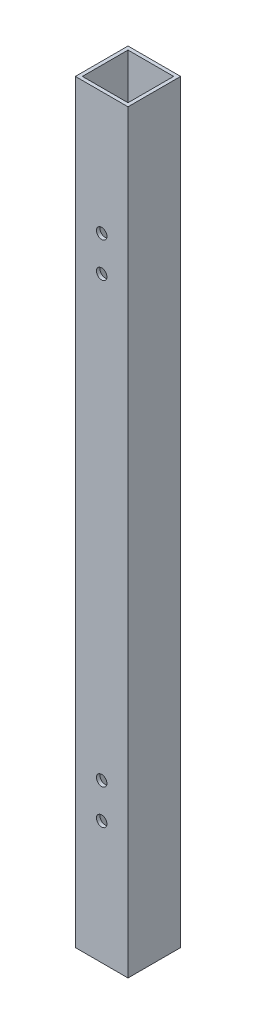
ISO-10303-21;
HEADER;
FILE_DESCRIPTION(('STEP AP214'),'2;1');
FILE_NAME('part.step','',(''),(''),'','','');
FILE_SCHEMA(('AUTOMOTIVE_DESIGN { 1 0 10303 214 1 1 1 1 }'));
ENDSEC;
DATA;
#1=APPLICATION_CONTEXT('core data for automotive mechanical design processes');
#2=APPLICATION_PROTOCOL_DEFINITION('international standard','automotive_design',2000,#1);
#3=PRODUCT_CONTEXT('',#1,'mechanical');
#4=PRODUCT('Part','Part','',(#3));
#5=PRODUCT_RELATED_PRODUCT_CATEGORY('part','',(#4));
#6=PRODUCT_DEFINITION_FORMATION('','',#4);
#7=PRODUCT_DEFINITION_CONTEXT('part definition',#1,'design');
#8=PRODUCT_DEFINITION('design','',#6,#7);
#9=PRODUCT_DEFINITION_SHAPE('','',#8);
#10=(LENGTH_UNIT() NAMED_UNIT(*) SI_UNIT(.MILLI.,.METRE.));
#11=(NAMED_UNIT(*) PLANE_ANGLE_UNIT() SI_UNIT($,.RADIAN.));
#12=(NAMED_UNIT(*) SI_UNIT($,.STERADIAN.) SOLID_ANGLE_UNIT());
#13=UNCERTAINTY_MEASURE_WITH_UNIT(LENGTH_MEASURE(1.E-05),#10,'distance_accuracy_value','');
#14=(GEOMETRIC_REPRESENTATION_CONTEXT(3) GLOBAL_UNCERTAINTY_ASSIGNED_CONTEXT((#13)) GLOBAL_UNIT_ASSIGNED_CONTEXT((#10,
#11,#12)) REPRESENTATION_CONTEXT('',''));
#15=CARTESIAN_POINT('',(0.,0.,0.));
#16=DIRECTION('',(0.,0.,1.));
#17=DIRECTION('',(1.,0.,0.));
#18=AXIS2_PLACEMENT_3D('',#15,#16,#17);
#19=CARTESIAN_POINT('',(15.,430.,15.));
#20=DIRECTION('',(0.,0.,-1.));
#21=DIRECTION('',(-1.,0.,0.));
#22=AXIS2_PLACEMENT_3D('',#19,#20,#21);
#23=PLANE('',#22);
#24=CARTESIAN_POINT('',(0.,70.,15.));
#25=DIRECTION('',(0.,0.,1.));
#26=DIRECTION('',(1.,0.,0.));
#27=AXIS2_PLACEMENT_3D('',#24,#25,#26);
#28=CIRCLE('',#27,3.);
#29=CARTESIAN_POINT('',(3.,70.,15.));
#30=VERTEX_POINT('',#29);
#31=EDGE_CURVE('E395',#30,#30,#28,.T.);
#32=ORIENTED_EDGE('',*,*,#31,.F.);
#33=EDGE_LOOP('',(#32));
#34=FACE_BOUND('',#33,.T.);
#35=CARTESIAN_POINT('',(0.,90.,15.));
#36=DIRECTION('',(0.,0.,1.));
#37=DIRECTION('',(1.,0.,0.));
#38=AXIS2_PLACEMENT_3D('',#35,#36,#37);
#39=CIRCLE('',#38,3.);
#40=CARTESIAN_POINT('',(3.,90.,15.));
#41=VERTEX_POINT('',#40);
#42=EDGE_CURVE('E181',#41,#41,#39,.T.);
#43=ORIENTED_EDGE('',*,*,#42,.F.);
#44=EDGE_LOOP('',(#43));
#45=FACE_BOUND('',#44,.T.);
#46=CARTESIAN_POINT('',(0.,340.,15.));
#47=DIRECTION('',(0.,0.,1.));
#48=DIRECTION('',(1.,0.,0.));
#49=AXIS2_PLACEMENT_3D('',#46,#47,#48);
#50=CIRCLE('',#49,3.);
#51=CARTESIAN_POINT('',(3.,340.,15.));
#52=VERTEX_POINT('',#51);
#53=EDGE_CURVE('E178',#52,#52,#50,.T.);
#54=ORIENTED_EDGE('',*,*,#53,.F.);
#55=EDGE_LOOP('',(#54));
#56=FACE_BOUND('',#55,.T.);
#57=CARTESIAN_POINT('',(0.,360.,15.));
#58=DIRECTION('',(0.,0.,1.));
#59=DIRECTION('',(1.,0.,0.));
#60=AXIS2_PLACEMENT_3D('',#57,#58,#59);
#61=CIRCLE('',#60,3.);
#62=CARTESIAN_POINT('',(3.,360.,15.));
#63=VERTEX_POINT('',#62);
#64=EDGE_CURVE('E197',#63,#63,#61,.T.);
#65=ORIENTED_EDGE('',*,*,#64,.F.);
#66=EDGE_LOOP('',(#65));
#67=FACE_BOUND('',#66,.T.);
#68=DIRECTION('',(1.,0.,0.));
#69=VECTOR('',#68,1.);
#70=CARTESIAN_POINT('',(15.,0.,15.));
#71=LINE('',#70,#69);
#72=CARTESIAN_POINT('',(-15.,0.,15.));
#73=VERTEX_POINT('',#72);
#74=CARTESIAN_POINT('',(15.,0.,15.));
#75=VERTEX_POINT('',#74);
#76=EDGE_CURVE('E134',#73,#75,#71,.T.);
#77=ORIENTED_EDGE('',*,*,#76,.T.);
#78=DIRECTION('',(0.,-1.,0.));
#79=VECTOR('',#78,1.);
#80=CARTESIAN_POINT('',(15.,430.,15.));
#81=LINE('',#80,#79);
#82=CARTESIAN_POINT('',(15.,430.,15.));
#83=VERTEX_POINT('',#82);
#84=EDGE_CURVE('E40',#83,#75,#81,.T.);
#85=ORIENTED_EDGE('',*,*,#84,.F.);
#86=DIRECTION('',(1.,0.,0.));
#87=VECTOR('',#86,1.);
#88=CARTESIAN_POINT('',(15.,430.,15.));
#89=LINE('',#88,#87);
#90=CARTESIAN_POINT('',(-15.,430.,15.));
#91=VERTEX_POINT('',#90);
#92=EDGE_CURVE('E141',#91,#83,#89,.T.);
#93=ORIENTED_EDGE('',*,*,#92,.F.);
#94=DIRECTION('',(0.,-1.,0.));
#95=VECTOR('',#94,1.);
#96=CARTESIAN_POINT('',(-15.,430.,15.));
#97=LINE('',#96,#95);
#98=EDGE_CURVE('E11',#91,#73,#97,.T.);
#99=ORIENTED_EDGE('',*,*,#98,.T.);
#100=EDGE_LOOP('',(#77,#85,#93,#99));
#101=FACE_BOUND('',#100,.T.);
#102=ADVANCED_FACE('F32',(#34,#45,#56,#67,#101),#23,.F.);
#103=CARTESIAN_POINT('',(15.,430.,-15.));
#104=DIRECTION('',(-1.,0.,0.));
#105=DIRECTION('',(0.,0.,1.));
#106=AXIS2_PLACEMENT_3D('',#103,#104,#105);
#107=PLANE('',#106);
#108=DIRECTION('',(0.,0.,-1.));
#109=VECTOR('',#108,1.);
#110=CARTESIAN_POINT('',(15.,0.,-15.));
#111=LINE('',#110,#109);
#112=CARTESIAN_POINT('',(15.,0.,-15.));
#113=VERTEX_POINT('',#112);
#114=EDGE_CURVE('E151',#75,#113,#111,.T.);
#115=ORIENTED_EDGE('',*,*,#114,.T.);
#116=DIRECTION('',(0.,-1.,0.));
#117=VECTOR('',#116,1.);
#118=CARTESIAN_POINT('',(15.,430.,-15.));
#119=LINE('',#118,#117);
#120=CARTESIAN_POINT('',(15.,430.,-15.));
#121=VERTEX_POINT('',#120);
#122=EDGE_CURVE('E158',#121,#113,#119,.T.);
#123=ORIENTED_EDGE('',*,*,#122,.F.);
#124=DIRECTION('',(0.,0.,-1.));
#125=VECTOR('',#124,1.);
#126=CARTESIAN_POINT('',(15.,430.,-15.));
#127=LINE('',#126,#125);
#128=EDGE_CURVE('E144',#83,#121,#127,.T.);
#129=ORIENTED_EDGE('',*,*,#128,.F.);
#130=ORIENTED_EDGE('',*,*,#84,.T.);
#131=EDGE_LOOP('',(#115,#123,#129,#130));
#132=FACE_BOUND('',#131,.T.);
#133=ADVANCED_FACE('F207',(#132),#107,.F.);
#134=CARTESIAN_POINT('',(-15.,430.,-15.));
#135=DIRECTION('',(0.,0.,1.));
#136=DIRECTION('',(1.,0.,0.));
#137=AXIS2_PLACEMENT_3D('',#134,#135,#136);
#138=PLANE('',#137);
#139=CARTESIAN_POINT('',(0.,70.,-15.));
#140=DIRECTION('',(0.,0.,1.));
#141=DIRECTION('',(1.,0.,0.));
#142=AXIS2_PLACEMENT_3D('',#139,#140,#141);
#143=CIRCLE('',#142,3.);
#144=CARTESIAN_POINT('',(3.,70.,-15.));
#145=VERTEX_POINT('',#144);
#146=EDGE_CURVE('E392',#145,#145,#143,.T.);
#147=ORIENTED_EDGE('',*,*,#146,.T.);
#148=EDGE_LOOP('',(#147));
#149=FACE_BOUND('',#148,.T.);
#150=CARTESIAN_POINT('',(0.,90.,-15.));
#151=DIRECTION('',(0.,0.,1.));
#152=DIRECTION('',(1.,0.,0.));
#153=AXIS2_PLACEMENT_3D('',#150,#151,#152);
#154=CIRCLE('',#153,3.);
#155=CARTESIAN_POINT('',(3.,90.,-15.));
#156=VERTEX_POINT('',#155);
#157=EDGE_CURVE('E174',#156,#156,#154,.T.);
#158=ORIENTED_EDGE('',*,*,#157,.T.);
#159=EDGE_LOOP('',(#158));
#160=FACE_BOUND('',#159,.T.);
#161=CARTESIAN_POINT('',(0.,340.,-15.));
#162=DIRECTION('',(0.,0.,1.));
#163=DIRECTION('',(1.,0.,0.));
#164=AXIS2_PLACEMENT_3D('',#161,#162,#163);
#165=CIRCLE('',#164,3.);
#166=CARTESIAN_POINT('',(3.,340.,-15.));
#167=VERTEX_POINT('',#166);
#168=EDGE_CURVE('E170',#167,#167,#165,.T.);
#169=ORIENTED_EDGE('',*,*,#168,.T.);
#170=EDGE_LOOP('',(#169));
#171=FACE_BOUND('',#170,.T.);
#172=CARTESIAN_POINT('',(0.,360.,-15.));
#173=DIRECTION('',(0.,0.,1.));
#174=DIRECTION('',(1.,0.,0.));
#175=AXIS2_PLACEMENT_3D('',#172,#173,#174);
#176=CIRCLE('',#175,3.);
#177=CARTESIAN_POINT('',(3.,360.,-15.));
#178=VERTEX_POINT('',#177);
#179=EDGE_CURVE('E166',#178,#178,#176,.T.);
#180=ORIENTED_EDGE('',*,*,#179,.T.);
#181=EDGE_LOOP('',(#180));
#182=FACE_BOUND('',#181,.T.);
#183=DIRECTION('',(-1.,0.,0.));
#184=VECTOR('',#183,1.);
#185=CARTESIAN_POINT('',(-15.,0.,-15.));
#186=LINE('',#185,#184);
#187=CARTESIAN_POINT('',(-15.,0.,-15.));
#188=VERTEX_POINT('',#187);
#189=EDGE_CURVE('E153',#113,#188,#186,.T.);
#190=ORIENTED_EDGE('',*,*,#189,.T.);
#191=DIRECTION('',(0.,-1.,0.));
#192=VECTOR('',#191,1.);
#193=CARTESIAN_POINT('',(-15.,430.,-15.));
#194=LINE('',#193,#192);
#195=CARTESIAN_POINT('',(-15.,430.,-15.));
#196=VERTEX_POINT('',#195);
#197=EDGE_CURVE('E149',#196,#188,#194,.T.);
#198=ORIENTED_EDGE('',*,*,#197,.F.);
#199=DIRECTION('',(-1.,0.,0.));
#200=VECTOR('',#199,1.);
#201=CARTESIAN_POINT('',(-15.,430.,-15.));
#202=LINE('',#201,#200);
#203=EDGE_CURVE('E146',#121,#196,#202,.T.);
#204=ORIENTED_EDGE('',*,*,#203,.F.);
#205=ORIENTED_EDGE('',*,*,#122,.T.);
#206=EDGE_LOOP('',(#190,#198,#204,#205));
#207=FACE_BOUND('',#206,.T.);
#208=ADVANCED_FACE('F220',(#149,#160,#171,#182,#207),#138,.F.);
#209=CARTESIAN_POINT('',(-15.,430.,0.));
#210=DIRECTION('',(1.,0.,0.));
#211=DIRECTION('',(0.,0.,-1.));
#212=AXIS2_PLACEMENT_3D('',#209,#210,#211);
#213=PLANE('',#212);
#214=DIRECTION('',(0.,0.,1.));
#215=VECTOR('',#214,1.);
#216=CARTESIAN_POINT('',(-15.,0.,0.));
#217=LINE('',#216,#215);
#218=EDGE_CURVE('E142',#188,#73,#217,.T.);
#219=ORIENTED_EDGE('',*,*,#218,.T.);
#220=ORIENTED_EDGE('',*,*,#98,.F.);
#221=DIRECTION('',(0.,0.,1.));
#222=VECTOR('',#221,1.);
#223=CARTESIAN_POINT('',(-15.,430.,15.));
#224=LINE('',#223,#222);
#225=EDGE_CURVE('E138',#196,#91,#224,.T.);
#226=ORIENTED_EDGE('',*,*,#225,.F.);
#227=ORIENTED_EDGE('',*,*,#197,.T.);
#228=EDGE_LOOP('',(#219,#220,#226,#227));
#229=FACE_BOUND('',#228,.T.);
#230=ADVANCED_FACE('F223',(#229),#213,.F.);
#231=CARTESIAN_POINT('',(0.,430.,0.));
#232=DIRECTION('',(0.,-1.,0.));
#233=DIRECTION('',(0.,0.,-1.));
#234=AXIS2_PLACEMENT_3D('',#231,#232,#233);
#235=PLANE('',#234);
#236=DIRECTION('',(0.,0.,-1.));
#237=VECTOR('',#236,1.);
#238=CARTESIAN_POINT('',(13.,430.,13.));
#239=LINE('',#238,#237);
#240=CARTESIAN_POINT('',(13.,430.,13.));
#241=VERTEX_POINT('',#240);
#242=CARTESIAN_POINT('',(13.,430.,-13.));
#243=VERTEX_POINT('',#242);
#244=EDGE_CURVE('E128',#241,#243,#239,.T.);
#245=ORIENTED_EDGE('',*,*,#244,.F.);
#246=DIRECTION('',(1.,0.,0.));
#247=VECTOR('',#246,1.);
#248=CARTESIAN_POINT('',(-13.,430.,13.));
#249=LINE('',#248,#247);
#250=CARTESIAN_POINT('',(-13.,430.,13.));
#251=VERTEX_POINT('',#250);
#252=EDGE_CURVE('E48',#251,#241,#249,.T.);
#253=ORIENTED_EDGE('',*,*,#252,.F.);
#254=DIRECTION('',(0.,0.,1.));
#255=VECTOR('',#254,1.);
#256=CARTESIAN_POINT('',(-13.,430.,-13.));
#257=LINE('',#256,#255);
#258=CARTESIAN_POINT('',(-13.,430.,-13.));
#259=VERTEX_POINT('',#258);
#260=EDGE_CURVE('E116',#259,#251,#257,.T.);
#261=ORIENTED_EDGE('',*,*,#260,.F.);
#262=DIRECTION('',(-1.,0.,0.));
#263=VECTOR('',#262,1.);
#264=CARTESIAN_POINT('',(13.,430.,-13.));
#265=LINE('',#264,#263);
#266=EDGE_CURVE('E119',#243,#259,#265,.T.);
#267=ORIENTED_EDGE('',*,*,#266,.F.);
#268=EDGE_LOOP('',(#245,#253,#261,#267));
#269=FACE_BOUND('',#268,.T.);
#270=ORIENTED_EDGE('',*,*,#225,.T.);
#271=ORIENTED_EDGE('',*,*,#92,.T.);
#272=ORIENTED_EDGE('',*,*,#128,.T.);
#273=ORIENTED_EDGE('',*,*,#203,.T.);
#274=EDGE_LOOP('',(#270,#271,#272,#273));
#275=FACE_BOUND('',#274,.T.);
#276=ADVANCED_FACE('F225',(#269,#275),#235,.F.);
#277=CARTESIAN_POINT('',(0.,0.,0.));
#278=DIRECTION('',(0.,-1.,0.));
#279=DIRECTION('',(0.,0.,-1.));
#280=AXIS2_PLACEMENT_3D('',#277,#278,#279);
#281=PLANE('',#280);
#282=DIRECTION('',(1.,0.,0.));
#283=VECTOR('',#282,1.);
#284=CARTESIAN_POINT('',(-13.,0.,13.));
#285=LINE('',#284,#283);
#286=CARTESIAN_POINT('',(-13.,0.,13.));
#287=VERTEX_POINT('',#286);
#288=CARTESIAN_POINT('',(13.,0.,13.));
#289=VERTEX_POINT('',#288);
#290=EDGE_CURVE('E100',#287,#289,#285,.T.);
#291=ORIENTED_EDGE('',*,*,#290,.T.);
#292=DIRECTION('',(0.,0.,-1.));
#293=VECTOR('',#292,1.);
#294=CARTESIAN_POINT('',(13.,0.,13.));
#295=LINE('',#294,#293);
#296=CARTESIAN_POINT('',(13.,0.,-13.));
#297=VERTEX_POINT('',#296);
#298=EDGE_CURVE('E109',#289,#297,#295,.T.);
#299=ORIENTED_EDGE('',*,*,#298,.T.);
#300=DIRECTION('',(-1.,0.,0.));
#301=VECTOR('',#300,1.);
#302=CARTESIAN_POINT('',(13.,0.,-13.));
#303=LINE('',#302,#301);
#304=CARTESIAN_POINT('',(-13.,0.,-13.));
#305=VERTEX_POINT('',#304);
#306=EDGE_CURVE('E56',#297,#305,#303,.T.);
#307=ORIENTED_EDGE('',*,*,#306,.T.);
#308=DIRECTION('',(0.,0.,1.));
#309=VECTOR('',#308,1.);
#310=CARTESIAN_POINT('',(-13.,0.,-13.));
#311=LINE('',#310,#309);
#312=EDGE_CURVE('E106',#305,#287,#311,.T.);
#313=ORIENTED_EDGE('',*,*,#312,.T.);
#314=EDGE_LOOP('',(#291,#299,#307,#313));
#315=FACE_BOUND('',#314,.T.);
#316=ORIENTED_EDGE('',*,*,#76,.F.);
#317=ORIENTED_EDGE('',*,*,#218,.F.);
#318=ORIENTED_EDGE('',*,*,#189,.F.);
#319=ORIENTED_EDGE('',*,*,#114,.F.);
#320=EDGE_LOOP('',(#316,#317,#318,#319));
#321=FACE_BOUND('',#320,.T.);
#322=ADVANCED_FACE('F113',(#315,#321),#281,.T.);
#323=CARTESIAN_POINT('',(-13.,0.,13.));
#324=DIRECTION('',(0.,0.,1.));
#325=DIRECTION('',(1.,0.,0.));
#326=AXIS2_PLACEMENT_3D('',#323,#324,#325);
#327=PLANE('',#326);
#328=CARTESIAN_POINT('',(0.,70.,13.));
#329=DIRECTION('',(0.,0.,1.));
#330=DIRECTION('',(1.,0.,0.));
#331=AXIS2_PLACEMENT_3D('',#328,#329,#330);
#332=CIRCLE('',#331,3.);
#333=CARTESIAN_POINT('',(3.,70.,13.));
#334=VERTEX_POINT('',#333);
#335=EDGE_CURVE('E186',#334,#334,#332,.T.);
#336=ORIENTED_EDGE('',*,*,#335,.T.);
#337=EDGE_LOOP('',(#336));
#338=FACE_BOUND('',#337,.T.);
#339=CARTESIAN_POINT('',(0.,90.,13.));
#340=DIRECTION('',(0.,0.,1.));
#341=DIRECTION('',(1.,0.,0.));
#342=AXIS2_PLACEMENT_3D('',#339,#340,#341);
#343=CIRCLE('',#342,3.);
#344=CARTESIAN_POINT('',(3.,90.,13.));
#345=VERTEX_POINT('',#344);
#346=EDGE_CURVE('E173',#345,#345,#343,.T.);
#347=ORIENTED_EDGE('',*,*,#346,.T.);
#348=EDGE_LOOP('',(#347));
#349=FACE_BOUND('',#348,.T.);
#350=CARTESIAN_POINT('',(0.,340.,13.));
#351=DIRECTION('',(0.,0.,1.));
#352=DIRECTION('',(1.,0.,0.));
#353=AXIS2_PLACEMENT_3D('',#350,#351,#352);
#354=CIRCLE('',#353,3.);
#355=CARTESIAN_POINT('',(3.,340.,13.));
#356=VERTEX_POINT('',#355);
#357=EDGE_CURVE('E169',#356,#356,#354,.T.);
#358=ORIENTED_EDGE('',*,*,#357,.T.);
#359=EDGE_LOOP('',(#358));
#360=FACE_BOUND('',#359,.T.);
#361=CARTESIAN_POINT('',(0.,360.,13.));
#362=DIRECTION('',(0.,0.,1.));
#363=DIRECTION('',(1.,0.,0.));
#364=AXIS2_PLACEMENT_3D('',#361,#362,#363);
#365=CIRCLE('',#364,3.);
#366=CARTESIAN_POINT('',(3.,360.,13.));
#367=VERTEX_POINT('',#366);
#368=EDGE_CURVE('E122',#367,#367,#365,.T.);
#369=ORIENTED_EDGE('',*,*,#368,.T.);
#370=EDGE_LOOP('',(#369));
#371=FACE_BOUND('',#370,.T.);
#372=ORIENTED_EDGE('',*,*,#252,.T.);
#373=DIRECTION('',(0.,1.,0.));
#374=VECTOR('',#373,1.);
#375=CARTESIAN_POINT('',(13.,0.,13.));
#376=LINE('',#375,#374);
#377=EDGE_CURVE('E96',#289,#241,#376,.T.);
#378=ORIENTED_EDGE('',*,*,#377,.F.);
#379=ORIENTED_EDGE('',*,*,#290,.F.);
#380=DIRECTION('',(0.,1.,0.));
#381=VECTOR('',#380,1.);
#382=CARTESIAN_POINT('',(-13.,0.,13.));
#383=LINE('',#382,#381);
#384=EDGE_CURVE('E132',#287,#251,#383,.T.);
#385=ORIENTED_EDGE('',*,*,#384,.T.);
#386=EDGE_LOOP('',(#372,#378,#379,#385));
#387=FACE_BOUND('',#386,.T.);
#388=ADVANCED_FACE('F98',(#338,#349,#360,#371,#387),#327,.F.);
#389=CARTESIAN_POINT('',(-13.,0.,-13.));
#390=DIRECTION('',(-1.,0.,0.));
#391=DIRECTION('',(0.,0.,1.));
#392=AXIS2_PLACEMENT_3D('',#389,#390,#391);
#393=PLANE('',#392);
#394=ORIENTED_EDGE('',*,*,#260,.T.);
#395=ORIENTED_EDGE('',*,*,#384,.F.);
#396=ORIENTED_EDGE('',*,*,#312,.F.);
#397=DIRECTION('',(0.,1.,0.));
#398=VECTOR('',#397,1.);
#399=CARTESIAN_POINT('',(-13.,0.,-13.));
#400=LINE('',#399,#398);
#401=EDGE_CURVE('E135',#305,#259,#400,.T.);
#402=ORIENTED_EDGE('',*,*,#401,.T.);
#403=EDGE_LOOP('',(#394,#395,#396,#402));
#404=FACE_BOUND('',#403,.T.);
#405=ADVANCED_FACE('F272',(#404),#393,.F.);
#406=CARTESIAN_POINT('',(13.,0.,-13.));
#407=DIRECTION('',(0.,0.,-1.));
#408=DIRECTION('',(-1.,0.,0.));
#409=AXIS2_PLACEMENT_3D('',#406,#407,#408);
#410=PLANE('',#409);
#411=CARTESIAN_POINT('',(0.,70.,-13.));
#412=DIRECTION('',(0.,0.,-1.));
#413=DIRECTION('',(-1.,0.,0.));
#414=AXIS2_PLACEMENT_3D('',#411,#412,#413);
#415=CIRCLE('',#414,3.);
#416=CARTESIAN_POINT('',(-3.,70.,-13.));
#417=VERTEX_POINT('',#416);
#418=EDGE_CURVE('E35',#417,#417,#415,.T.);
#419=ORIENTED_EDGE('',*,*,#418,.T.);
#420=EDGE_LOOP('',(#419));
#421=FACE_BOUND('',#420,.T.);
#422=CARTESIAN_POINT('',(0.,90.,-13.));
#423=DIRECTION('',(0.,0.,-1.));
#424=DIRECTION('',(-1.,0.,0.));
#425=AXIS2_PLACEMENT_3D('',#422,#423,#424);
#426=CIRCLE('',#425,3.);
#427=CARTESIAN_POINT('',(-3.,90.,-13.));
#428=VERTEX_POINT('',#427);
#429=EDGE_CURVE('E171',#428,#428,#426,.T.);
#430=ORIENTED_EDGE('',*,*,#429,.T.);
#431=EDGE_LOOP('',(#430));
#432=FACE_BOUND('',#431,.T.);
#433=CARTESIAN_POINT('',(0.,340.,-13.));
#434=DIRECTION('',(0.,0.,-1.));
#435=DIRECTION('',(-1.,0.,0.));
#436=AXIS2_PLACEMENT_3D('',#433,#434,#435);
#437=CIRCLE('',#436,3.);
#438=CARTESIAN_POINT('',(-3.,340.,-13.));
#439=VERTEX_POINT('',#438);
#440=EDGE_CURVE('E167',#439,#439,#437,.T.);
#441=ORIENTED_EDGE('',*,*,#440,.T.);
#442=EDGE_LOOP('',(#441));
#443=FACE_BOUND('',#442,.T.);
#444=CARTESIAN_POINT('',(0.,360.,-13.));
#445=DIRECTION('',(0.,0.,-1.));
#446=DIRECTION('',(-1.,0.,0.));
#447=AXIS2_PLACEMENT_3D('',#444,#445,#446);
#448=CIRCLE('',#447,3.);
#449=CARTESIAN_POINT('',(-3.,360.,-13.));
#450=VERTEX_POINT('',#449);
#451=EDGE_CURVE('E163',#450,#450,#448,.T.);
#452=ORIENTED_EDGE('',*,*,#451,.T.);
#453=EDGE_LOOP('',(#452));
#454=FACE_BOUND('',#453,.T.);
#455=ORIENTED_EDGE('',*,*,#266,.T.);
#456=ORIENTED_EDGE('',*,*,#401,.F.);
#457=ORIENTED_EDGE('',*,*,#306,.F.);
#458=DIRECTION('',(0.,1.,0.));
#459=VECTOR('',#458,1.);
#460=CARTESIAN_POINT('',(13.,0.,-13.));
#461=LINE('',#460,#459);
#462=EDGE_CURVE('E105',#297,#243,#461,.T.);
#463=ORIENTED_EDGE('',*,*,#462,.T.);
#464=EDGE_LOOP('',(#455,#456,#457,#463));
#465=FACE_BOUND('',#464,.T.);
#466=ADVANCED_FACE('F277',(#421,#432,#443,#454,#465),#410,.F.);
#467=CARTESIAN_POINT('',(13.,0.,13.));
#468=DIRECTION('',(1.,0.,0.));
#469=DIRECTION('',(0.,0.,-1.));
#470=AXIS2_PLACEMENT_3D('',#467,#468,#469);
#471=PLANE('',#470);
#472=ORIENTED_EDGE('',*,*,#244,.T.);
#473=ORIENTED_EDGE('',*,*,#462,.F.);
#474=ORIENTED_EDGE('',*,*,#298,.F.);
#475=ORIENTED_EDGE('',*,*,#377,.T.);
#476=EDGE_LOOP('',(#472,#473,#474,#475));
#477=FACE_BOUND('',#476,.T.);
#478=ADVANCED_FACE('F110',(#477),#471,.F.);
#479=CARTESIAN_POINT('',(0.,360.,-15.));
#480=DIRECTION('',(0.,0.,1.));
#481=DIRECTION('',(1.,0.,0.));
#482=AXIS2_PLACEMENT_3D('',#479,#480,#481);
#483=CYLINDRICAL_SURFACE('',#482,3.);
#484=ORIENTED_EDGE('',*,*,#179,.F.);
#485=EDGE_LOOP('',(#484));
#486=FACE_BOUND('',#485,.T.);
#487=ORIENTED_EDGE('',*,*,#451,.F.);
#488=EDGE_LOOP('',(#487));
#489=FACE_BOUND('',#488,.T.);
#490=ADVANCED_FACE('F288',(#486,#489),#483,.F.);
#491=ORIENTED_EDGE('',*,*,#64,.T.);
#492=EDGE_LOOP('',(#491));
#493=FACE_BOUND('',#492,.T.);
#494=ORIENTED_EDGE('',*,*,#368,.F.);
#495=EDGE_LOOP('',(#494));
#496=FACE_BOUND('',#495,.T.);
#497=ADVANCED_FACE('F202',(#493,#496),#483,.F.);
#498=CARTESIAN_POINT('',(0.,340.,-15.));
#499=DIRECTION('',(0.,0.,1.));
#500=DIRECTION('',(1.,0.,0.));
#501=AXIS2_PLACEMENT_3D('',#498,#499,#500);
#502=CYLINDRICAL_SURFACE('',#501,3.);
#503=ORIENTED_EDGE('',*,*,#168,.F.);
#504=EDGE_LOOP('',(#503));
#505=FACE_BOUND('',#504,.T.);
#506=ORIENTED_EDGE('',*,*,#440,.F.);
#507=EDGE_LOOP('',(#506));
#508=FACE_BOUND('',#507,.T.);
#509=ADVANCED_FACE('F315',(#505,#508),#502,.F.);
#510=ORIENTED_EDGE('',*,*,#53,.T.);
#511=EDGE_LOOP('',(#510));
#512=FACE_BOUND('',#511,.T.);
#513=ORIENTED_EDGE('',*,*,#357,.F.);
#514=EDGE_LOOP('',(#513));
#515=FACE_BOUND('',#514,.T.);
#516=ADVANCED_FACE('F321',(#512,#515),#502,.F.);
#517=CARTESIAN_POINT('',(0.,90.,-15.));
#518=DIRECTION('',(0.,0.,1.));
#519=DIRECTION('',(1.,0.,0.));
#520=AXIS2_PLACEMENT_3D('',#517,#518,#519);
#521=CYLINDRICAL_SURFACE('',#520,3.);
#522=ORIENTED_EDGE('',*,*,#157,.F.);
#523=EDGE_LOOP('',(#522));
#524=FACE_BOUND('',#523,.T.);
#525=ORIENTED_EDGE('',*,*,#429,.F.);
#526=EDGE_LOOP('',(#525));
#527=FACE_BOUND('',#526,.T.);
#528=ADVANCED_FACE('F329',(#524,#527),#521,.F.);
#529=ORIENTED_EDGE('',*,*,#42,.T.);
#530=EDGE_LOOP('',(#529));
#531=FACE_BOUND('',#530,.T.);
#532=ORIENTED_EDGE('',*,*,#346,.F.);
#533=EDGE_LOOP('',(#532));
#534=FACE_BOUND('',#533,.T.);
#535=ADVANCED_FACE('F336',(#531,#534),#521,.F.);
#536=CARTESIAN_POINT('',(0.,70.,-15.));
#537=DIRECTION('',(0.,0.,1.));
#538=DIRECTION('',(1.,0.,0.));
#539=AXIS2_PLACEMENT_3D('',#536,#537,#538);
#540=CYLINDRICAL_SURFACE('',#539,3.);
#541=ORIENTED_EDGE('',*,*,#146,.F.);
#542=EDGE_LOOP('',(#541));
#543=FACE_BOUND('',#542,.T.);
#544=ORIENTED_EDGE('',*,*,#418,.F.);
#545=EDGE_LOOP('',(#544));
#546=FACE_BOUND('',#545,.T.);
#547=ADVANCED_FACE('F344',(#543,#546),#540,.F.);
#548=ORIENTED_EDGE('',*,*,#31,.T.);
#549=EDGE_LOOP('',(#548));
#550=FACE_BOUND('',#549,.T.);
#551=ORIENTED_EDGE('',*,*,#335,.F.);
#552=EDGE_LOOP('',(#551));
#553=FACE_BOUND('',#552,.T.);
#554=ADVANCED_FACE('F351',(#550,#553),#540,.F.);
#555=CLOSED_SHELL('',(#102,#133,#208,#230,#276,#322,#388,#405,#466,#478,#490,#497,#509,#516,
#528,#535,#547,#554));
#556=MANIFOLD_SOLID_BREP('B2',#555);
#557=ADVANCED_BREP_SHAPE_REPRESENTATION('',(#18,#556),#14);
#558=SHAPE_DEFINITION_REPRESENTATION(#9,#557);
ENDSEC;
END-ISO-10303-21;
